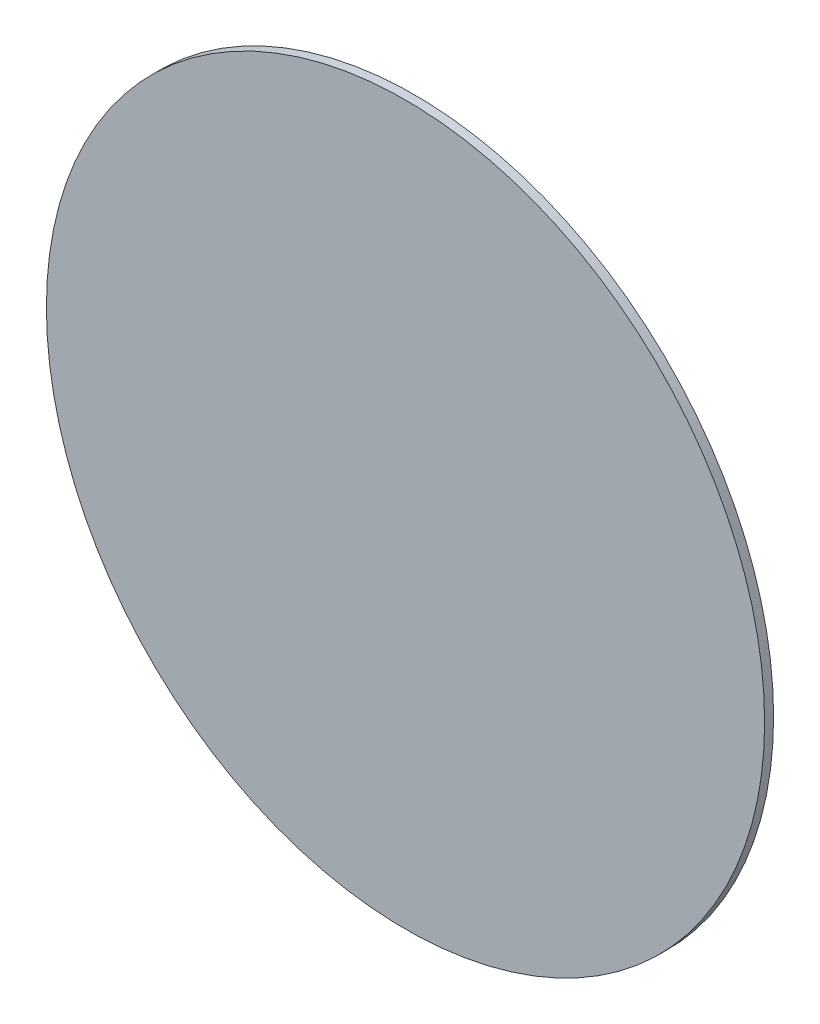
ISO-10303-21;
HEADER;
FILE_DESCRIPTION(('STEP AP214'),'2;1');
FILE_NAME('part.step','',(''),(''),'','','');
FILE_SCHEMA(('AUTOMOTIVE_DESIGN { 1 0 10303 214 1 1 1 1 }'));
ENDSEC;
DATA;
#1=APPLICATION_CONTEXT('core data for automotive mechanical design processes');
#2=APPLICATION_PROTOCOL_DEFINITION('international standard','automotive_design',2000,#1);
#3=PRODUCT_CONTEXT('',#1,'mechanical');
#4=PRODUCT('Part','Part','',(#3));
#5=PRODUCT_RELATED_PRODUCT_CATEGORY('part','',(#4));
#6=PRODUCT_DEFINITION_FORMATION('','',#4);
#7=PRODUCT_DEFINITION_CONTEXT('part definition',#1,'design');
#8=PRODUCT_DEFINITION('design','',#6,#7);
#9=PRODUCT_DEFINITION_SHAPE('','',#8);
#10=(LENGTH_UNIT() NAMED_UNIT(*) SI_UNIT(.MILLI.,.METRE.));
#11=(NAMED_UNIT(*) PLANE_ANGLE_UNIT() SI_UNIT($,.RADIAN.));
#12=(NAMED_UNIT(*) SI_UNIT($,.STERADIAN.) SOLID_ANGLE_UNIT());
#13=UNCERTAINTY_MEASURE_WITH_UNIT(LENGTH_MEASURE(1.E-05),#10,'distance_accuracy_value','');
#14=(GEOMETRIC_REPRESENTATION_CONTEXT(3) GLOBAL_UNCERTAINTY_ASSIGNED_CONTEXT((#13)) GLOBAL_UNIT_ASSIGNED_CONTEXT((#10,
#11,#12)) REPRESENTATION_CONTEXT('',''));
#15=CARTESIAN_POINT('',(0.,0.,0.));
#16=DIRECTION('',(0.,0.,1.));
#17=DIRECTION('',(1.,0.,0.));
#18=AXIS2_PLACEMENT_3D('',#15,#16,#17);
#19=CARTESIAN_POINT('',(0.,0.,-0.1));
#20=DIRECTION('',(0.,0.,1.));
#21=DIRECTION('',(1.,0.,0.));
#22=AXIS2_PLACEMENT_3D('',#19,#20,#21);
#23=CYLINDRICAL_SURFACE('',#22,4.);
#24=CARTESIAN_POINT('',(0.,0.,-0.1));
#25=DIRECTION('',(0.,0.,1.));
#26=DIRECTION('',(1.,0.,0.));
#27=AXIS2_PLACEMENT_3D('',#24,#25,#26);
#28=CIRCLE('',#27,4.);
#29=CARTESIAN_POINT('',(4.,0.,-0.1));
#30=VERTEX_POINT('',#29);
#31=EDGE_CURVE('E10',#30,#30,#28,.T.);
#32=ORIENTED_EDGE('',*,*,#31,.T.);
#33=EDGE_LOOP('',(#32));
#34=FACE_BOUND('',#33,.T.);
#35=CARTESIAN_POINT('',(0.,0.,0.));
#36=DIRECTION('',(0.,0.,1.));
#37=DIRECTION('',(1.,0.,0.));
#38=AXIS2_PLACEMENT_3D('',#35,#36,#37);
#39=CIRCLE('',#38,4.);
#40=CARTESIAN_POINT('',(4.,0.,0.));
#41=VERTEX_POINT('',#40);
#42=EDGE_CURVE('E40',#41,#41,#39,.T.);
#43=ORIENTED_EDGE('',*,*,#42,.F.);
#44=EDGE_LOOP('',(#43));
#45=FACE_BOUND('',#44,.T.);
#46=ADVANCED_FACE('F37',(#34,#45),#23,.T.);
#47=CARTESIAN_POINT('',(0.,0.,-0.1));
#48=DIRECTION('',(0.,0.,1.));
#49=DIRECTION('',(1.,0.,0.));
#50=AXIS2_PLACEMENT_3D('',#47,#48,#49);
#51=PLANE('',#50);
#52=ORIENTED_EDGE('',*,*,#31,.F.);
#53=EDGE_LOOP('',(#52));
#54=FACE_BOUND('',#53,.T.);
#55=ADVANCED_FACE('F54',(#54),#51,.F.);
#56=CARTESIAN_POINT('',(0.,0.,0.));
#57=DIRECTION('',(0.,0.,1.));
#58=DIRECTION('',(1.,0.,0.));
#59=AXIS2_PLACEMENT_3D('',#56,#57,#58);
#60=PLANE('',#59);
#61=ORIENTED_EDGE('',*,*,#42,.T.);
#62=EDGE_LOOP('',(#61));
#63=FACE_BOUND('',#62,.T.);
#64=ADVANCED_FACE('F51',(#63),#60,.T.);
#65=CLOSED_SHELL('',(#46,#55,#64));
#66=MANIFOLD_SOLID_BREP('B2',#65);
#67=ADVANCED_BREP_SHAPE_REPRESENTATION('',(#18,#66),#14);
#68=SHAPE_DEFINITION_REPRESENTATION(#9,#67);
ENDSEC;
END-ISO-10303-21;
